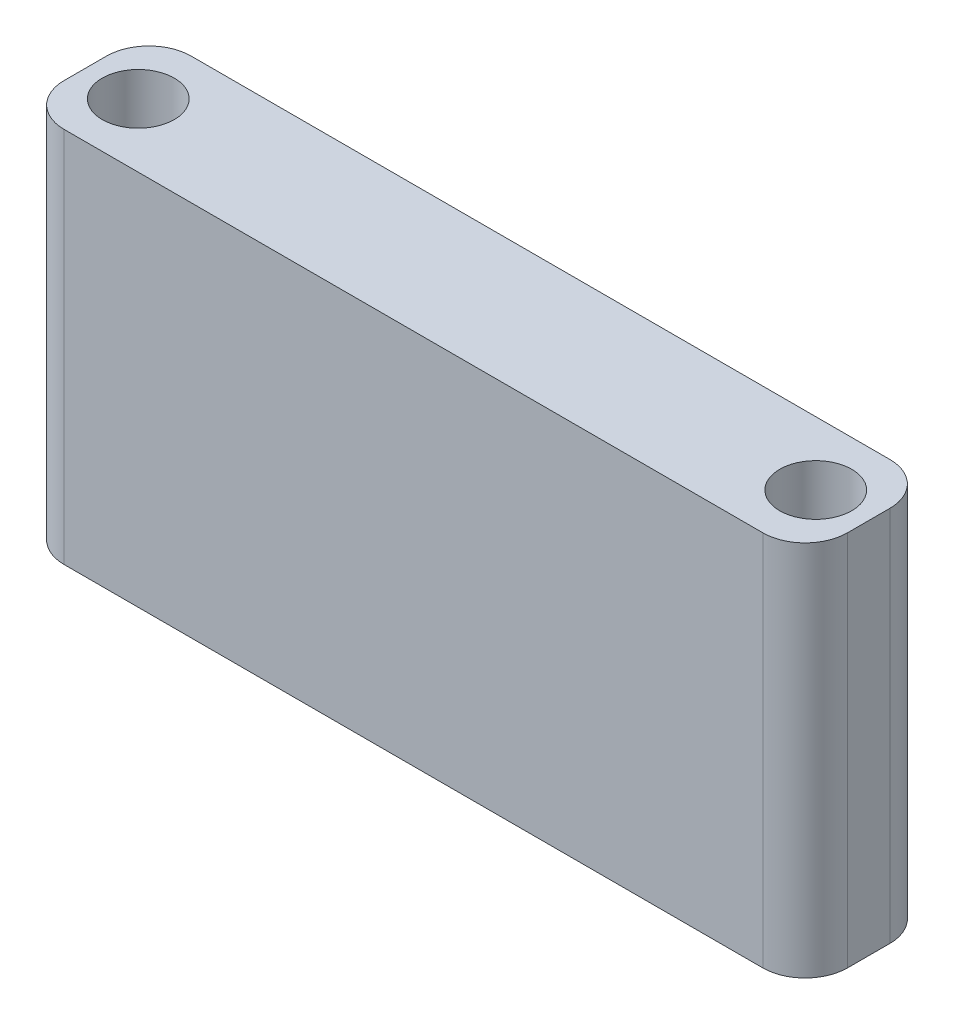
ISO-10303-21;
HEADER;
FILE_DESCRIPTION(('STEP AP214'),'2;1');
FILE_NAME('part.step','',(''),(''),'','','');
FILE_SCHEMA(('AUTOMOTIVE_DESIGN { 1 0 10303 214 1 1 1 1 }'));
ENDSEC;
DATA;
#1=APPLICATION_CONTEXT('core data for automotive mechanical design processes');
#2=APPLICATION_PROTOCOL_DEFINITION('international standard','automotive_design',2000,#1);
#3=PRODUCT_CONTEXT('',#1,'mechanical');
#4=PRODUCT('Part','Part','',(#3));
#5=PRODUCT_RELATED_PRODUCT_CATEGORY('part','',(#4));
#6=PRODUCT_DEFINITION_FORMATION('','',#4);
#7=PRODUCT_DEFINITION_CONTEXT('part definition',#1,'design');
#8=PRODUCT_DEFINITION('design','',#6,#7);
#9=PRODUCT_DEFINITION_SHAPE('','',#8);
#10=(LENGTH_UNIT() NAMED_UNIT(*) SI_UNIT(.MILLI.,.METRE.));
#11=(NAMED_UNIT(*) PLANE_ANGLE_UNIT() SI_UNIT($,.RADIAN.));
#12=(NAMED_UNIT(*) SI_UNIT($,.STERADIAN.) SOLID_ANGLE_UNIT());
#13=UNCERTAINTY_MEASURE_WITH_UNIT(LENGTH_MEASURE(1.E-05),#10,'distance_accuracy_value','');
#14=(GEOMETRIC_REPRESENTATION_CONTEXT(3) GLOBAL_UNCERTAINTY_ASSIGNED_CONTEXT((#13)) GLOBAL_UNIT_ASSIGNED_CONTEXT((#10,
#11,#12)) REPRESENTATION_CONTEXT('',''));
#15=CARTESIAN_POINT('',(0.,0.,0.));
#16=DIRECTION('',(0.,0.,1.));
#17=DIRECTION('',(1.,0.,0.));
#18=AXIS2_PLACEMENT_3D('',#15,#16,#17);
#19=CARTESIAN_POINT('',(0.,17.8,0.));
#20=DIRECTION('',(0.,-1.,0.));
#21=DIRECTION('',(0.,0.,-1.));
#22=AXIS2_PLACEMENT_3D('',#19,#20,#21);
#23=PLANE('',#22);
#24=DIRECTION('',(0.,0.,1.));
#25=VECTOR('',#24,1.);
#26=CARTESIAN_POINT('',(0.,17.8,0.));
#27=LINE('',#26,#25);
#28=CARTESIAN_POINT('',(0.,17.8,-4.));
#29=VERTEX_POINT('',#28);
#30=CARTESIAN_POINT('',(0.,17.8,-2.));
#31=VERTEX_POINT('',#30);
#32=EDGE_CURVE('E139',#29,#31,#27,.T.);
#33=ORIENTED_EDGE('',*,*,#32,.T.);
#34=CARTESIAN_POINT('',(2.,17.8,-2.));
#35=DIRECTION('',(0.,-1.,0.));
#36=DIRECTION('',(0.,0.,-1.));
#37=AXIS2_PLACEMENT_3D('',#34,#35,#36);
#38=CIRCLE('',#37,2.);
#39=CARTESIAN_POINT('',(2.,17.8,0.));
#40=VERTEX_POINT('',#39);
#41=EDGE_CURVE('E153',#31,#40,#38,.F.);
#42=ORIENTED_EDGE('',*,*,#41,.T.);
#43=DIRECTION('',(1.,0.,0.));
#44=VECTOR('',#43,1.);
#45=CARTESIAN_POINT('',(0.,17.8,0.));
#46=LINE('',#45,#44);
#47=CARTESIAN_POINT('',(35.,17.8,0.));
#48=VERTEX_POINT('',#47);
#49=EDGE_CURVE('E120',#40,#48,#46,.T.);
#50=ORIENTED_EDGE('',*,*,#49,.T.);
#51=CARTESIAN_POINT('',(35.,17.8,-2.));
#52=DIRECTION('',(0.,-1.,0.));
#53=DIRECTION('',(0.,0.,-1.));
#54=AXIS2_PLACEMENT_3D('',#51,#52,#53);
#55=CIRCLE('',#54,2.);
#56=CARTESIAN_POINT('',(37.,17.8,-2.));
#57=VERTEX_POINT('',#56);
#58=EDGE_CURVE('E149',#48,#57,#55,.F.);
#59=ORIENTED_EDGE('',*,*,#58,.T.);
#60=DIRECTION('',(0.,0.,-1.));
#61=VECTOR('',#60,1.);
#62=CARTESIAN_POINT('',(37.,17.8,0.));
#63=LINE('',#62,#61);
#64=CARTESIAN_POINT('',(37.,17.8,-4.));
#65=VERTEX_POINT('',#64);
#66=EDGE_CURVE('E162',#57,#65,#63,.T.);
#67=ORIENTED_EDGE('',*,*,#66,.T.);
#68=CARTESIAN_POINT('',(35.,17.8,-4.));
#69=DIRECTION('',(0.,-1.,0.));
#70=DIRECTION('',(0.,0.,-1.));
#71=AXIS2_PLACEMENT_3D('',#68,#69,#70);
#72=CIRCLE('',#71,2.);
#73=CARTESIAN_POINT('',(35.,17.8,-6.));
#74=VERTEX_POINT('',#73);
#75=EDGE_CURVE('E55',#65,#74,#72,.F.);
#76=ORIENTED_EDGE('',*,*,#75,.T.);
#77=DIRECTION('',(-1.,0.,0.));
#78=VECTOR('',#77,1.);
#79=CARTESIAN_POINT('',(0.,17.8,-6.));
#80=LINE('',#79,#78);
#81=CARTESIAN_POINT('',(2.,17.8,-6.));
#82=VERTEX_POINT('',#81);
#83=EDGE_CURVE('E140',#74,#82,#80,.T.);
#84=ORIENTED_EDGE('',*,*,#83,.T.);
#85=CARTESIAN_POINT('',(2.,17.8,-4.));
#86=DIRECTION('',(0.,-1.,0.));
#87=DIRECTION('',(0.,0.,-1.));
#88=AXIS2_PLACEMENT_3D('',#85,#86,#87);
#89=CIRCLE('',#88,2.);
#90=EDGE_CURVE('E151',#82,#29,#89,.F.);
#91=ORIENTED_EDGE('',*,*,#90,.T.);
#92=EDGE_LOOP('',(#33,#42,#50,#59,#67,#76,#84,#91));
#93=FACE_BOUND('',#92,.T.);
#94=CARTESIAN_POINT('',(2.5,17.8,-3.));
#95=DIRECTION('',(0.,1.,0.));
#96=DIRECTION('',(0.,0.,1.));
#97=AXIS2_PLACEMENT_3D('',#94,#95,#96);
#98=CIRCLE('',#97,1.7);
#99=CARTESIAN_POINT('',(2.5,17.8,-1.3));
#100=VERTEX_POINT('',#99);
#101=EDGE_CURVE('E134',#100,#100,#98,.T.);
#102=ORIENTED_EDGE('',*,*,#101,.F.);
#103=EDGE_LOOP('',(#102));
#104=FACE_BOUND('',#103,.T.);
#105=CARTESIAN_POINT('',(34.5,17.8,-3.));
#106=DIRECTION('',(0.,1.,0.));
#107=DIRECTION('',(0.,0.,1.));
#108=AXIS2_PLACEMENT_3D('',#105,#106,#107);
#109=CIRCLE('',#108,1.7);
#110=CARTESIAN_POINT('',(34.5,17.8,-1.3));
#111=VERTEX_POINT('',#110);
#112=EDGE_CURVE('E185',#111,#111,#109,.T.);
#113=ORIENTED_EDGE('',*,*,#112,.F.);
#114=EDGE_LOOP('',(#113));
#115=FACE_BOUND('',#114,.T.);
#116=ADVANCED_FACE('F33',(#93,#104,#115),#23,.F.);
#117=CARTESIAN_POINT('',(0.,0.,0.));
#118=DIRECTION('',(0.,-1.,0.));
#119=DIRECTION('',(0.,0.,-1.));
#120=AXIS2_PLACEMENT_3D('',#117,#118,#119);
#121=PLANE('',#120);
#122=CARTESIAN_POINT('',(2.5,0.,-3.));
#123=DIRECTION('',(0.,1.,0.));
#124=DIRECTION('',(0.,0.,1.));
#125=AXIS2_PLACEMENT_3D('',#122,#123,#124);
#126=CIRCLE('',#125,1.7);
#127=CARTESIAN_POINT('',(2.5,0.,-1.3));
#128=VERTEX_POINT('',#127);
#129=EDGE_CURVE('E182',#128,#128,#126,.T.);
#130=ORIENTED_EDGE('',*,*,#129,.T.);
#131=EDGE_LOOP('',(#130));
#132=FACE_BOUND('',#131,.T.);
#133=DIRECTION('',(1.,0.,0.));
#134=VECTOR('',#133,1.);
#135=CARTESIAN_POINT('',(0.,0.,0.));
#136=LINE('',#135,#134);
#137=CARTESIAN_POINT('',(2.,0.,0.));
#138=VERTEX_POINT('',#137);
#139=CARTESIAN_POINT('',(35.,0.,0.));
#140=VERTEX_POINT('',#139);
#141=EDGE_CURVE('E117',#138,#140,#136,.T.);
#142=ORIENTED_EDGE('',*,*,#141,.F.);
#143=CARTESIAN_POINT('',(2.,0.,-2.));
#144=DIRECTION('',(0.,-1.,0.));
#145=DIRECTION('',(0.,0.,-1.));
#146=AXIS2_PLACEMENT_3D('',#143,#144,#145);
#147=CIRCLE('',#146,2.);
#148=CARTESIAN_POINT('',(0.,0.,-2.));
#149=VERTEX_POINT('',#148);
#150=EDGE_CURVE('E100',#138,#149,#147,.T.);
#151=ORIENTED_EDGE('',*,*,#150,.T.);
#152=DIRECTION('',(0.,0.,1.));
#153=VECTOR('',#152,1.);
#154=CARTESIAN_POINT('',(0.,0.,0.));
#155=LINE('',#154,#153);
#156=CARTESIAN_POINT('',(0.,0.,-4.));
#157=VERTEX_POINT('',#156);
#158=EDGE_CURVE('E129',#157,#149,#155,.T.);
#159=ORIENTED_EDGE('',*,*,#158,.F.);
#160=CARTESIAN_POINT('',(2.,0.,-4.));
#161=DIRECTION('',(0.,-1.,0.));
#162=DIRECTION('',(0.,0.,-1.));
#163=AXIS2_PLACEMENT_3D('',#160,#161,#162);
#164=CIRCLE('',#163,2.);
#165=CARTESIAN_POINT('',(2.,0.,-6.));
#166=VERTEX_POINT('',#165);
#167=EDGE_CURVE('E111',#157,#166,#164,.T.);
#168=ORIENTED_EDGE('',*,*,#167,.T.);
#169=DIRECTION('',(-1.,0.,0.));
#170=VECTOR('',#169,1.);
#171=CARTESIAN_POINT('',(0.,0.,-6.));
#172=LINE('',#171,#170);
#173=CARTESIAN_POINT('',(35.,0.,-6.));
#174=VERTEX_POINT('',#173);
#175=EDGE_CURVE('E132',#174,#166,#172,.T.);
#176=ORIENTED_EDGE('',*,*,#175,.F.);
#177=CARTESIAN_POINT('',(35.,0.,-4.));
#178=DIRECTION('',(0.,-1.,0.));
#179=DIRECTION('',(0.,0.,-1.));
#180=AXIS2_PLACEMENT_3D('',#177,#178,#179);
#181=CIRCLE('',#180,2.);
#182=CARTESIAN_POINT('',(37.,0.,-4.));
#183=VERTEX_POINT('',#182);
#184=EDGE_CURVE('E121',#174,#183,#181,.T.);
#185=ORIENTED_EDGE('',*,*,#184,.T.);
#186=DIRECTION('',(0.,0.,-1.));
#187=VECTOR('',#186,1.);
#188=CARTESIAN_POINT('',(37.,0.,0.));
#189=LINE('',#188,#187);
#190=CARTESIAN_POINT('',(37.,0.,-2.));
#191=VERTEX_POINT('',#190);
#192=EDGE_CURVE('E128',#191,#183,#189,.T.);
#193=ORIENTED_EDGE('',*,*,#192,.F.);
#194=CARTESIAN_POINT('',(35.,0.,-2.));
#195=DIRECTION('',(0.,-1.,0.));
#196=DIRECTION('',(0.,0.,-1.));
#197=AXIS2_PLACEMENT_3D('',#194,#195,#196);
#198=CIRCLE('',#197,2.);
#199=EDGE_CURVE('E127',#191,#140,#198,.T.);
#200=ORIENTED_EDGE('',*,*,#199,.T.);
#201=EDGE_LOOP('',(#142,#151,#159,#168,#176,#185,#193,#200));
#202=FACE_BOUND('',#201,.T.);
#203=CARTESIAN_POINT('',(34.5,0.,-3.));
#204=DIRECTION('',(0.,1.,0.));
#205=DIRECTION('',(0.,0.,1.));
#206=AXIS2_PLACEMENT_3D('',#203,#204,#205);
#207=CIRCLE('',#206,1.7);
#208=CARTESIAN_POINT('',(34.5,0.,-1.3));
#209=VERTEX_POINT('',#208);
#210=EDGE_CURVE('E188',#209,#209,#207,.T.);
#211=ORIENTED_EDGE('',*,*,#210,.T.);
#212=EDGE_LOOP('',(#211));
#213=FACE_BOUND('',#212,.T.);
#214=ADVANCED_FACE('F124',(#132,#202,#213),#121,.T.);
#215=CARTESIAN_POINT('',(0.,17.8,0.));
#216=DIRECTION('',(1.,0.,0.));
#217=DIRECTION('',(0.,0.,-1.));
#218=AXIS2_PLACEMENT_3D('',#215,#216,#217);
#219=PLANE('',#218);
#220=ORIENTED_EDGE('',*,*,#158,.T.);
#221=DIRECTION('',(0.,-1.,0.));
#222=VECTOR('',#221,1.);
#223=CARTESIAN_POINT('',(0.,17.8,-2.));
#224=LINE('',#223,#222);
#225=EDGE_CURVE('E105',#149,#31,#224,.F.);
#226=ORIENTED_EDGE('',*,*,#225,.T.);
#227=ORIENTED_EDGE('',*,*,#32,.F.);
#228=DIRECTION('',(0.,-1.,0.));
#229=VECTOR('',#228,1.);
#230=CARTESIAN_POINT('',(0.,17.8,-4.));
#231=LINE('',#230,#229);
#232=EDGE_CURVE('E110',#29,#157,#231,.T.);
#233=ORIENTED_EDGE('',*,*,#232,.T.);
#234=EDGE_LOOP('',(#220,#226,#227,#233));
#235=FACE_BOUND('',#234,.T.);
#236=ADVANCED_FACE('F178',(#235),#219,.F.);
#237=CARTESIAN_POINT('',(0.,17.8,0.));
#238=DIRECTION('',(0.,0.,-1.));
#239=DIRECTION('',(-1.,0.,0.));
#240=AXIS2_PLACEMENT_3D('',#237,#238,#239);
#241=PLANE('',#240);
#242=ORIENTED_EDGE('',*,*,#49,.F.);
#243=DIRECTION('',(0.,-1.,0.));
#244=VECTOR('',#243,1.);
#245=CARTESIAN_POINT('',(2.,17.8,0.));
#246=LINE('',#245,#244);
#247=EDGE_CURVE('E104',#40,#138,#246,.T.);
#248=ORIENTED_EDGE('',*,*,#247,.T.);
#249=ORIENTED_EDGE('',*,*,#141,.T.);
#250=DIRECTION('',(0.,-1.,0.));
#251=VECTOR('',#250,1.);
#252=CARTESIAN_POINT('',(35.,17.8,0.));
#253=LINE('',#252,#251);
#254=EDGE_CURVE('E122',#140,#48,#253,.F.);
#255=ORIENTED_EDGE('',*,*,#254,.T.);
#256=EDGE_LOOP('',(#242,#248,#249,#255));
#257=FACE_BOUND('',#256,.T.);
#258=ADVANCED_FACE('F116',(#257),#241,.F.);
#259=CARTESIAN_POINT('',(37.,17.8,0.));
#260=DIRECTION('',(-1.,0.,0.));
#261=DIRECTION('',(0.,0.,1.));
#262=AXIS2_PLACEMENT_3D('',#259,#260,#261);
#263=PLANE('',#262);
#264=ORIENTED_EDGE('',*,*,#66,.F.);
#265=DIRECTION('',(0.,-1.,0.));
#266=VECTOR('',#265,1.);
#267=CARTESIAN_POINT('',(37.,17.8,-2.));
#268=LINE('',#267,#266);
#269=EDGE_CURVE('E11',#57,#191,#268,.T.);
#270=ORIENTED_EDGE('',*,*,#269,.T.);
#271=ORIENTED_EDGE('',*,*,#192,.T.);
#272=DIRECTION('',(0.,-1.,0.));
#273=VECTOR('',#272,1.);
#274=CARTESIAN_POINT('',(37.,17.8,-4.));
#275=LINE('',#274,#273);
#276=EDGE_CURVE('E41',#183,#65,#275,.F.);
#277=ORIENTED_EDGE('',*,*,#276,.T.);
#278=EDGE_LOOP('',(#264,#270,#271,#277));
#279=FACE_BOUND('',#278,.T.);
#280=ADVANCED_FACE('F161',(#279),#263,.F.);
#281=CARTESIAN_POINT('',(0.,17.8,-6.));
#282=DIRECTION('',(0.,0.,1.));
#283=DIRECTION('',(1.,0.,0.));
#284=AXIS2_PLACEMENT_3D('',#281,#282,#283);
#285=PLANE('',#284);
#286=ORIENTED_EDGE('',*,*,#175,.T.);
#287=DIRECTION('',(0.,-1.,0.));
#288=VECTOR('',#287,1.);
#289=CARTESIAN_POINT('',(2.,17.8,-6.));
#290=LINE('',#289,#288);
#291=EDGE_CURVE('E48',#166,#82,#290,.F.);
#292=ORIENTED_EDGE('',*,*,#291,.T.);
#293=ORIENTED_EDGE('',*,*,#83,.F.);
#294=DIRECTION('',(0.,-1.,0.));
#295=VECTOR('',#294,1.);
#296=CARTESIAN_POINT('',(35.,17.8,-6.));
#297=LINE('',#296,#295);
#298=EDGE_CURVE('E155',#74,#174,#297,.T.);
#299=ORIENTED_EDGE('',*,*,#298,.T.);
#300=EDGE_LOOP('',(#286,#292,#293,#299));
#301=FACE_BOUND('',#300,.T.);
#302=ADVANCED_FACE('F171',(#301),#285,.F.);
#303=CARTESIAN_POINT('',(2.5,17.8,-3.));
#304=DIRECTION('',(0.,-1.,0.));
#305=DIRECTION('',(0.,0.,-1.));
#306=AXIS2_PLACEMENT_3D('',#303,#304,#305);
#307=CYLINDRICAL_SURFACE('',#306,1.7);
#308=ORIENTED_EDGE('',*,*,#101,.T.);
#309=EDGE_LOOP('',(#308));
#310=FACE_BOUND('',#309,.T.);
#311=ORIENTED_EDGE('',*,*,#129,.F.);
#312=EDGE_LOOP('',(#311));
#313=FACE_BOUND('',#312,.T.);
#314=ADVANCED_FACE('F205',(#310,#313),#307,.F.);
#315=CARTESIAN_POINT('',(34.5,17.8,-3.));
#316=DIRECTION('',(0.,-1.,0.));
#317=DIRECTION('',(0.,0.,-1.));
#318=AXIS2_PLACEMENT_3D('',#315,#316,#317);
#319=CYLINDRICAL_SURFACE('',#318,1.7);
#320=ORIENTED_EDGE('',*,*,#112,.T.);
#321=EDGE_LOOP('',(#320));
#322=FACE_BOUND('',#321,.T.);
#323=ORIENTED_EDGE('',*,*,#210,.F.);
#324=EDGE_LOOP('',(#323));
#325=FACE_BOUND('',#324,.T.);
#326=ADVANCED_FACE('F194',(#322,#325),#319,.F.);
#327=CARTESIAN_POINT('',(2.,17.8,-2.));
#328=DIRECTION('',(0.,-1.,0.));
#329=DIRECTION('',(0.,0.,-1.));
#330=AXIS2_PLACEMENT_3D('',#327,#328,#329);
#331=CYLINDRICAL_SURFACE('',#330,2.);
#332=ORIENTED_EDGE('',*,*,#41,.F.);
#333=ORIENTED_EDGE('',*,*,#225,.F.);
#334=ORIENTED_EDGE('',*,*,#150,.F.);
#335=ORIENTED_EDGE('',*,*,#247,.F.);
#336=EDGE_LOOP('',(#332,#333,#334,#335));
#337=FACE_BOUND('',#336,.T.);
#338=ADVANCED_FACE('F103',(#337),#331,.T.);
#339=CARTESIAN_POINT('',(2.,17.8,-4.));
#340=DIRECTION('',(0.,-1.,0.));
#341=DIRECTION('',(0.,0.,-1.));
#342=AXIS2_PLACEMENT_3D('',#339,#340,#341);
#343=CYLINDRICAL_SURFACE('',#342,2.);
#344=ORIENTED_EDGE('',*,*,#90,.F.);
#345=ORIENTED_EDGE('',*,*,#291,.F.);
#346=ORIENTED_EDGE('',*,*,#167,.F.);
#347=ORIENTED_EDGE('',*,*,#232,.F.);
#348=EDGE_LOOP('',(#344,#345,#346,#347));
#349=FACE_BOUND('',#348,.T.);
#350=ADVANCED_FACE('F175',(#349),#343,.T.);
#351=CARTESIAN_POINT('',(35.,17.8,-2.));
#352=DIRECTION('',(0.,-1.,0.));
#353=DIRECTION('',(0.,0.,-1.));
#354=AXIS2_PLACEMENT_3D('',#351,#352,#353);
#355=CYLINDRICAL_SURFACE('',#354,2.);
#356=ORIENTED_EDGE('',*,*,#58,.F.);
#357=ORIENTED_EDGE('',*,*,#254,.F.);
#358=ORIENTED_EDGE('',*,*,#199,.F.);
#359=ORIENTED_EDGE('',*,*,#269,.F.);
#360=EDGE_LOOP('',(#356,#357,#358,#359));
#361=FACE_BOUND('',#360,.T.);
#362=ADVANCED_FACE('F219',(#361),#355,.T.);
#363=CARTESIAN_POINT('',(35.,17.8,-4.));
#364=DIRECTION('',(0.,-1.,0.));
#365=DIRECTION('',(0.,0.,-1.));
#366=AXIS2_PLACEMENT_3D('',#363,#364,#365);
#367=CYLINDRICAL_SURFACE('',#366,2.);
#368=ORIENTED_EDGE('',*,*,#75,.F.);
#369=ORIENTED_EDGE('',*,*,#276,.F.);
#370=ORIENTED_EDGE('',*,*,#184,.F.);
#371=ORIENTED_EDGE('',*,*,#298,.F.);
#372=EDGE_LOOP('',(#368,#369,#370,#371));
#373=FACE_BOUND('',#372,.T.);
#374=ADVANCED_FACE('F35',(#373),#367,.T.);
#375=CLOSED_SHELL('',(#116,#214,#236,#258,#280,#302,#314,#326,#338,#350,#362,#374));
#376=MANIFOLD_SOLID_BREP('B2',#375);
#377=ADVANCED_BREP_SHAPE_REPRESENTATION('',(#18,#376),#14);
#378=SHAPE_DEFINITION_REPRESENTATION(#9,#377);
ENDSEC;
END-ISO-10303-21;
